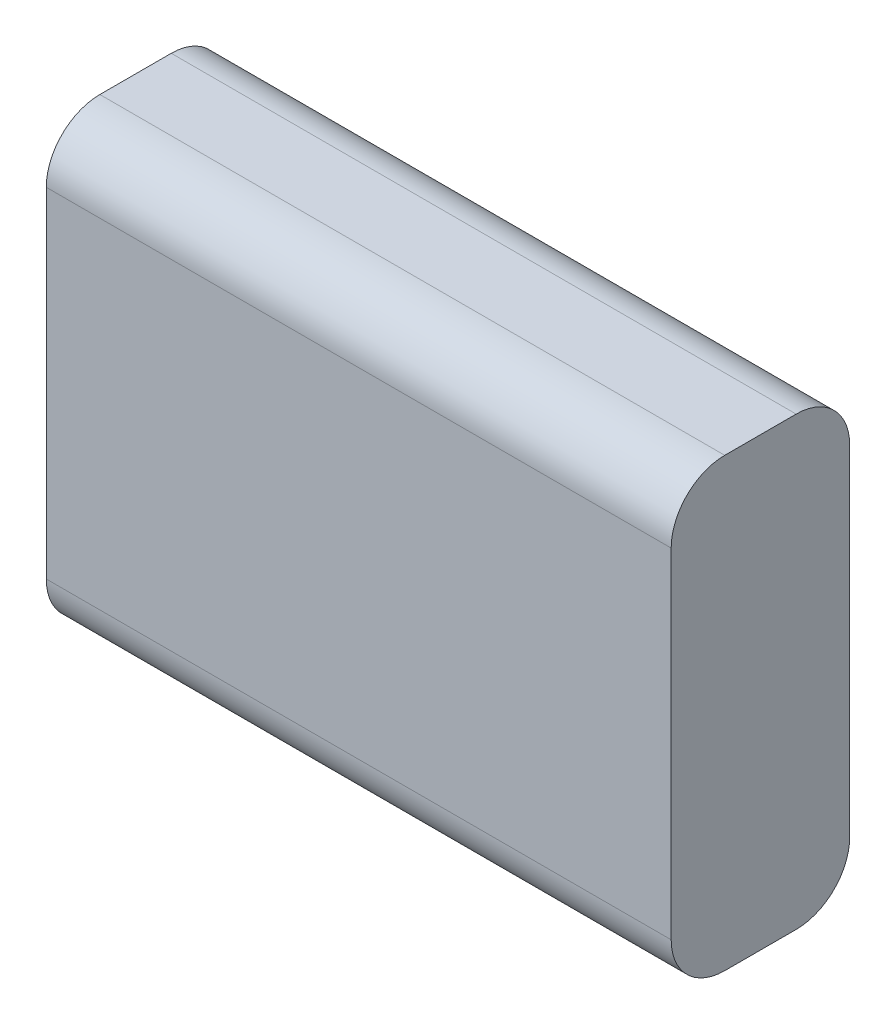
ISO-10303-21;
HEADER;
FILE_DESCRIPTION(('STEP AP214'),'2;1');
FILE_NAME('part.step','',(''),(''),'','','');
FILE_SCHEMA(('AUTOMOTIVE_DESIGN { 1 0 10303 214 1 1 1 1 }'));
ENDSEC;
DATA;
#1=APPLICATION_CONTEXT('core data for automotive mechanical design processes');
#2=APPLICATION_PROTOCOL_DEFINITION('international standard','automotive_design',2000,#1);
#3=PRODUCT_CONTEXT('',#1,'mechanical');
#4=PRODUCT('Part','Part','',(#3));
#5=PRODUCT_RELATED_PRODUCT_CATEGORY('part','',(#4));
#6=PRODUCT_DEFINITION_FORMATION('','',#4);
#7=PRODUCT_DEFINITION_CONTEXT('part definition',#1,'design');
#8=PRODUCT_DEFINITION('design','',#6,#7);
#9=PRODUCT_DEFINITION_SHAPE('','',#8);
#10=(LENGTH_UNIT() NAMED_UNIT(*) SI_UNIT(.MILLI.,.METRE.));
#11=(NAMED_UNIT(*) PLANE_ANGLE_UNIT() SI_UNIT($,.RADIAN.));
#12=(NAMED_UNIT(*) SI_UNIT($,.STERADIAN.) SOLID_ANGLE_UNIT());
#13=UNCERTAINTY_MEASURE_WITH_UNIT(LENGTH_MEASURE(1.E-05),#10,'distance_accuracy_value','');
#14=(GEOMETRIC_REPRESENTATION_CONTEXT(3) GLOBAL_UNCERTAINTY_ASSIGNED_CONTEXT((#13)) GLOBAL_UNIT_ASSIGNED_CONTEXT((#10,
#11,#12)) REPRESENTATION_CONTEXT('',''));
#15=CARTESIAN_POINT('',(0.,0.,0.));
#16=DIRECTION('',(0.,0.,1.));
#17=DIRECTION('',(1.,0.,0.));
#18=AXIS2_PLACEMENT_3D('',#15,#16,#17);
#19=CARTESIAN_POINT('',(0.,0.,10.));
#20=DIRECTION('',(1.,0.,0.));
#21=DIRECTION('',(0.,0.,-1.));
#22=AXIS2_PLACEMENT_3D('',#19,#20,#21);
#23=PLANE('',#22);
#24=DIRECTION('',(0.,-1.,0.));
#25=VECTOR('',#24,1.);
#26=CARTESIAN_POINT('',(0.,0.,0.));
#27=LINE('',#26,#25);
#28=CARTESIAN_POINT('',(0.,22.,0.));
#29=VERTEX_POINT('',#28);
#30=CARTESIAN_POINT('',(0.,3.,0.));
#31=VERTEX_POINT('',#30);
#32=EDGE_CURVE('E172',#29,#31,#27,.T.);
#33=ORIENTED_EDGE('',*,*,#32,.T.);
#34=CARTESIAN_POINT('',(0.,3.,3.));
#35=DIRECTION('',(1.,0.,0.));
#36=DIRECTION('',(0.,0.,-1.));
#37=AXIS2_PLACEMENT_3D('',#34,#35,#36);
#38=CIRCLE('',#37,3.);
#39=CARTESIAN_POINT('',(0.,0.,3.));
#40=VERTEX_POINT('',#39);
#41=EDGE_CURVE('E146',#31,#40,#38,.F.);
#42=ORIENTED_EDGE('',*,*,#41,.T.);
#43=DIRECTION('',(0.,0.,-1.));
#44=VECTOR('',#43,1.);
#45=CARTESIAN_POINT('',(0.,0.,10.));
#46=LINE('',#45,#44);
#47=CARTESIAN_POINT('',(0.,0.,7.));
#48=VERTEX_POINT('',#47);
#49=EDGE_CURVE('E125',#48,#40,#46,.T.);
#50=ORIENTED_EDGE('',*,*,#49,.F.);
#51=CARTESIAN_POINT('',(0.,3.,7.));
#52=DIRECTION('',(1.,0.,0.));
#53=DIRECTION('',(0.,0.,-1.));
#54=AXIS2_PLACEMENT_3D('',#51,#52,#53);
#55=CIRCLE('',#54,3.);
#56=CARTESIAN_POINT('',(0.,3.,10.));
#57=VERTEX_POINT('',#56);
#58=EDGE_CURVE('E130',#48,#57,#55,.F.);
#59=ORIENTED_EDGE('',*,*,#58,.T.);
#60=DIRECTION('',(0.,-1.,0.));
#61=VECTOR('',#60,1.);
#62=CARTESIAN_POINT('',(0.,0.,10.));
#63=LINE('',#62,#61);
#64=CARTESIAN_POINT('',(0.,22.,10.));
#65=VERTEX_POINT('',#64);
#66=EDGE_CURVE('E167',#65,#57,#63,.T.);
#67=ORIENTED_EDGE('',*,*,#66,.F.);
#68=CARTESIAN_POINT('',(0.,22.,7.));
#69=DIRECTION('',(1.,0.,0.));
#70=DIRECTION('',(0.,0.,-1.));
#71=AXIS2_PLACEMENT_3D('',#68,#69,#70);
#72=CIRCLE('',#71,3.);
#73=CARTESIAN_POINT('',(0.,25.,7.));
#74=VERTEX_POINT('',#73);
#75=EDGE_CURVE('E60',#65,#74,#72,.F.);
#76=ORIENTED_EDGE('',*,*,#75,.T.);
#77=DIRECTION('',(0.,0.,-1.));
#78=VECTOR('',#77,1.);
#79=CARTESIAN_POINT('',(0.,25.,10.));
#80=LINE('',#79,#78);
#81=CARTESIAN_POINT('',(0.,25.,3.));
#82=VERTEX_POINT('',#81);
#83=EDGE_CURVE('E157',#74,#82,#80,.T.);
#84=ORIENTED_EDGE('',*,*,#83,.T.);
#85=CARTESIAN_POINT('',(0.,22.,3.));
#86=DIRECTION('',(1.,0.,0.));
#87=DIRECTION('',(0.,0.,-1.));
#88=AXIS2_PLACEMENT_3D('',#85,#86,#87);
#89=CIRCLE('',#88,3.);
#90=EDGE_CURVE('E53',#82,#29,#89,.F.);
#91=ORIENTED_EDGE('',*,*,#90,.T.);
#92=EDGE_LOOP('',(#33,#42,#50,#59,#67,#76,#84,#91));
#93=FACE_BOUND('',#92,.T.);
#94=ADVANCED_FACE('F38',(#93),#23,.F.);
#95=CARTESIAN_POINT('',(0.,0.,10.));
#96=DIRECTION('',(0.,1.,0.));
#97=DIRECTION('',(0.,0.,1.));
#98=AXIS2_PLACEMENT_3D('',#95,#96,#97);
#99=PLANE('',#98);
#100=ORIENTED_EDGE('',*,*,#49,.T.);
#101=DIRECTION('',(1.,0.,0.));
#102=VECTOR('',#101,1.);
#103=CARTESIAN_POINT('',(35.,0.,3.));
#104=LINE('',#103,#102);
#105=CARTESIAN_POINT('',(35.,0.,3.));
#106=VERTEX_POINT('',#105);
#107=EDGE_CURVE('E124',#40,#106,#104,.T.);
#108=ORIENTED_EDGE('',*,*,#107,.T.);
#109=DIRECTION('',(0.,0.,-1.));
#110=VECTOR('',#109,1.);
#111=CARTESIAN_POINT('',(35.,0.,10.));
#112=LINE('',#111,#110);
#113=CARTESIAN_POINT('',(35.,0.,7.));
#114=VERTEX_POINT('',#113);
#115=EDGE_CURVE('E107',#114,#106,#112,.T.);
#116=ORIENTED_EDGE('',*,*,#115,.F.);
#117=DIRECTION('',(1.,0.,0.));
#118=VECTOR('',#117,1.);
#119=CARTESIAN_POINT('',(0.,0.,7.));
#120=LINE('',#119,#118);
#121=EDGE_CURVE('E121',#114,#48,#120,.F.);
#122=ORIENTED_EDGE('',*,*,#121,.T.);
#123=EDGE_LOOP('',(#100,#108,#116,#122));
#124=FACE_BOUND('',#123,.T.);
#125=ADVANCED_FACE('F120',(#124),#99,.F.);
#126=CARTESIAN_POINT('',(35.,0.,10.));
#127=DIRECTION('',(-1.,0.,0.));
#128=DIRECTION('',(0.,0.,1.));
#129=AXIS2_PLACEMENT_3D('',#126,#127,#128);
#130=PLANE('',#129);
#131=ORIENTED_EDGE('',*,*,#115,.T.);
#132=CARTESIAN_POINT('',(35.,3.,3.));
#133=DIRECTION('',(-1.,0.,0.));
#134=DIRECTION('',(0.,0.,1.));
#135=AXIS2_PLACEMENT_3D('',#132,#133,#134);
#136=CIRCLE('',#135,3.);
#137=CARTESIAN_POINT('',(35.,3.,0.));
#138=VERTEX_POINT('',#137);
#139=EDGE_CURVE('E114',#106,#138,#136,.F.);
#140=ORIENTED_EDGE('',*,*,#139,.T.);
#141=DIRECTION('',(0.,1.,0.));
#142=VECTOR('',#141,1.);
#143=CARTESIAN_POINT('',(35.,0.,0.));
#144=LINE('',#143,#142);
#145=CARTESIAN_POINT('',(35.,22.,0.));
#146=VERTEX_POINT('',#145);
#147=EDGE_CURVE('E169',#138,#146,#144,.T.);
#148=ORIENTED_EDGE('',*,*,#147,.T.);
#149=CARTESIAN_POINT('',(35.,22.,3.));
#150=DIRECTION('',(-1.,0.,0.));
#151=DIRECTION('',(0.,0.,1.));
#152=AXIS2_PLACEMENT_3D('',#149,#150,#151);
#153=CIRCLE('',#152,3.);
#154=CARTESIAN_POINT('',(35.,25.,3.));
#155=VERTEX_POINT('',#154);
#156=EDGE_CURVE('E115',#146,#155,#153,.F.);
#157=ORIENTED_EDGE('',*,*,#156,.T.);
#158=DIRECTION('',(0.,0.,-1.));
#159=VECTOR('',#158,1.);
#160=CARTESIAN_POINT('',(35.,25.,10.));
#161=LINE('',#160,#159);
#162=CARTESIAN_POINT('',(35.,25.,7.));
#163=VERTEX_POINT('',#162);
#164=EDGE_CURVE('E126',#163,#155,#161,.T.);
#165=ORIENTED_EDGE('',*,*,#164,.F.);
#166=CARTESIAN_POINT('',(35.,22.,7.));
#167=DIRECTION('',(-1.,0.,0.));
#168=DIRECTION('',(0.,0.,1.));
#169=AXIS2_PLACEMENT_3D('',#166,#167,#168);
#170=CIRCLE('',#169,3.);
#171=CARTESIAN_POINT('',(35.,22.,10.));
#172=VERTEX_POINT('',#171);
#173=EDGE_CURVE('E132',#163,#172,#170,.F.);
#174=ORIENTED_EDGE('',*,*,#173,.T.);
#175=DIRECTION('',(0.,1.,0.));
#176=VECTOR('',#175,1.);
#177=CARTESIAN_POINT('',(35.,0.,10.));
#178=LINE('',#177,#176);
#179=CARTESIAN_POINT('',(35.,3.,10.));
#180=VERTEX_POINT('',#179);
#181=EDGE_CURVE('E109',#180,#172,#178,.T.);
#182=ORIENTED_EDGE('',*,*,#181,.F.);
#183=CARTESIAN_POINT('',(35.,3.,7.));
#184=DIRECTION('',(-1.,0.,0.));
#185=DIRECTION('',(0.,0.,1.));
#186=AXIS2_PLACEMENT_3D('',#183,#184,#185);
#187=CIRCLE('',#186,3.);
#188=EDGE_CURVE('E104',#180,#114,#187,.F.);
#189=ORIENTED_EDGE('',*,*,#188,.T.);
#190=EDGE_LOOP('',(#131,#140,#148,#157,#165,#174,#182,#189));
#191=FACE_BOUND('',#190,.T.);
#192=ADVANCED_FACE('F106',(#191),#130,.F.);
#193=CARTESIAN_POINT('',(0.,25.,10.));
#194=DIRECTION('',(0.,-1.,0.));
#195=DIRECTION('',(0.,0.,-1.));
#196=AXIS2_PLACEMENT_3D('',#193,#194,#195);
#197=PLANE('',#196);
#198=ORIENTED_EDGE('',*,*,#164,.T.);
#199=DIRECTION('',(-1.,0.,0.));
#200=VECTOR('',#199,1.);
#201=CARTESIAN_POINT('',(0.,25.,3.));
#202=LINE('',#201,#200);
#203=EDGE_CURVE('E11',#155,#82,#202,.T.);
#204=ORIENTED_EDGE('',*,*,#203,.T.);
#205=ORIENTED_EDGE('',*,*,#83,.F.);
#206=DIRECTION('',(-1.,0.,0.));
#207=VECTOR('',#206,1.);
#208=CARTESIAN_POINT('',(0.,25.,7.));
#209=LINE('',#208,#207);
#210=EDGE_CURVE('E46',#74,#163,#209,.F.);
#211=ORIENTED_EDGE('',*,*,#210,.T.);
#212=EDGE_LOOP('',(#198,#204,#205,#211));
#213=FACE_BOUND('',#212,.T.);
#214=ADVANCED_FACE('F156',(#213),#197,.F.);
#215=CARTESIAN_POINT('',(0.,0.,10.));
#216=DIRECTION('',(0.,0.,-1.));
#217=DIRECTION('',(-1.,0.,0.));
#218=AXIS2_PLACEMENT_3D('',#215,#216,#217);
#219=PLANE('',#218);
#220=ORIENTED_EDGE('',*,*,#66,.T.);
#221=DIRECTION('',(1.,0.,0.));
#222=VECTOR('',#221,1.);
#223=CARTESIAN_POINT('',(0.,3.,10.));
#224=LINE('',#223,#222);
#225=EDGE_CURVE('E151',#57,#180,#224,.T.);
#226=ORIENTED_EDGE('',*,*,#225,.T.);
#227=ORIENTED_EDGE('',*,*,#181,.T.);
#228=DIRECTION('',(-1.,0.,0.));
#229=VECTOR('',#228,1.);
#230=CARTESIAN_POINT('',(0.,22.,10.));
#231=LINE('',#230,#229);
#232=EDGE_CURVE('E148',#172,#65,#231,.T.);
#233=ORIENTED_EDGE('',*,*,#232,.T.);
#234=EDGE_LOOP('',(#220,#226,#227,#233));
#235=FACE_BOUND('',#234,.T.);
#236=ADVANCED_FACE('F166',(#235),#219,.F.);
#237=CARTESIAN_POINT('',(0.,0.,0.));
#238=DIRECTION('',(0.,0.,-1.));
#239=DIRECTION('',(-1.,0.,0.));
#240=AXIS2_PLACEMENT_3D('',#237,#238,#239);
#241=PLANE('',#240);
#242=ORIENTED_EDGE('',*,*,#147,.F.);
#243=DIRECTION('',(1.,0.,0.));
#244=VECTOR('',#243,1.);
#245=CARTESIAN_POINT('',(0.,3.,0.));
#246=LINE('',#245,#244);
#247=EDGE_CURVE('E141',#138,#31,#246,.F.);
#248=ORIENTED_EDGE('',*,*,#247,.T.);
#249=ORIENTED_EDGE('',*,*,#32,.F.);
#250=DIRECTION('',(-1.,0.,0.));
#251=VECTOR('',#250,1.);
#252=CARTESIAN_POINT('',(35.,22.,0.));
#253=LINE('',#252,#251);
#254=EDGE_CURVE('E139',#29,#146,#253,.F.);
#255=ORIENTED_EDGE('',*,*,#254,.T.);
#256=EDGE_LOOP('',(#242,#248,#249,#255));
#257=FACE_BOUND('',#256,.T.);
#258=ADVANCED_FACE('F180',(#257),#241,.T.);
#259=CARTESIAN_POINT('',(0.,3.,3.));
#260=DIRECTION('',(-1.,0.,0.));
#261=DIRECTION('',(0.,0.,1.));
#262=AXIS2_PLACEMENT_3D('',#259,#260,#261);
#263=CYLINDRICAL_SURFACE('',#262,3.);
#264=ORIENTED_EDGE('',*,*,#41,.F.);
#265=ORIENTED_EDGE('',*,*,#247,.F.);
#266=ORIENTED_EDGE('',*,*,#139,.F.);
#267=ORIENTED_EDGE('',*,*,#107,.F.);
#268=EDGE_LOOP('',(#264,#265,#266,#267));
#269=FACE_BOUND('',#268,.T.);
#270=ADVANCED_FACE('F188',(#269),#263,.T.);
#271=CARTESIAN_POINT('',(0.,3.,7.));
#272=DIRECTION('',(1.,0.,0.));
#273=DIRECTION('',(0.,0.,-1.));
#274=AXIS2_PLACEMENT_3D('',#271,#272,#273);
#275=CYLINDRICAL_SURFACE('',#274,3.);
#276=ORIENTED_EDGE('',*,*,#58,.F.);
#277=ORIENTED_EDGE('',*,*,#121,.F.);
#278=ORIENTED_EDGE('',*,*,#188,.F.);
#279=ORIENTED_EDGE('',*,*,#225,.F.);
#280=EDGE_LOOP('',(#276,#277,#278,#279));
#281=FACE_BOUND('',#280,.T.);
#282=ADVANCED_FACE('F129',(#281),#275,.T.);
#283=CARTESIAN_POINT('',(0.,22.,3.));
#284=DIRECTION('',(1.,0.,0.));
#285=DIRECTION('',(0.,0.,-1.));
#286=AXIS2_PLACEMENT_3D('',#283,#284,#285);
#287=CYLINDRICAL_SURFACE('',#286,3.);
#288=ORIENTED_EDGE('',*,*,#156,.F.);
#289=ORIENTED_EDGE('',*,*,#254,.F.);
#290=ORIENTED_EDGE('',*,*,#90,.F.);
#291=ORIENTED_EDGE('',*,*,#203,.F.);
#292=EDGE_LOOP('',(#288,#289,#290,#291));
#293=FACE_BOUND('',#292,.T.);
#294=ADVANCED_FACE('F182',(#293),#287,.T.);
#295=CARTESIAN_POINT('',(0.,22.,7.));
#296=DIRECTION('',(-1.,0.,0.));
#297=DIRECTION('',(0.,0.,1.));
#298=AXIS2_PLACEMENT_3D('',#295,#296,#297);
#299=CYLINDRICAL_SURFACE('',#298,3.);
#300=ORIENTED_EDGE('',*,*,#173,.F.);
#301=ORIENTED_EDGE('',*,*,#210,.F.);
#302=ORIENTED_EDGE('',*,*,#75,.F.);
#303=ORIENTED_EDGE('',*,*,#232,.F.);
#304=EDGE_LOOP('',(#300,#301,#302,#303));
#305=FACE_BOUND('',#304,.T.);
#306=ADVANCED_FACE('F40',(#305),#299,.T.);
#307=CLOSED_SHELL('',(#94,#125,#192,#214,#236,#258,#270,#282,#294,#306));
#308=MANIFOLD_SOLID_BREP('B2',#307);
#309=ADVANCED_BREP_SHAPE_REPRESENTATION('',(#18,#308),#14);
#310=SHAPE_DEFINITION_REPRESENTATION(#9,#309);
ENDSEC;
END-ISO-10303-21;
